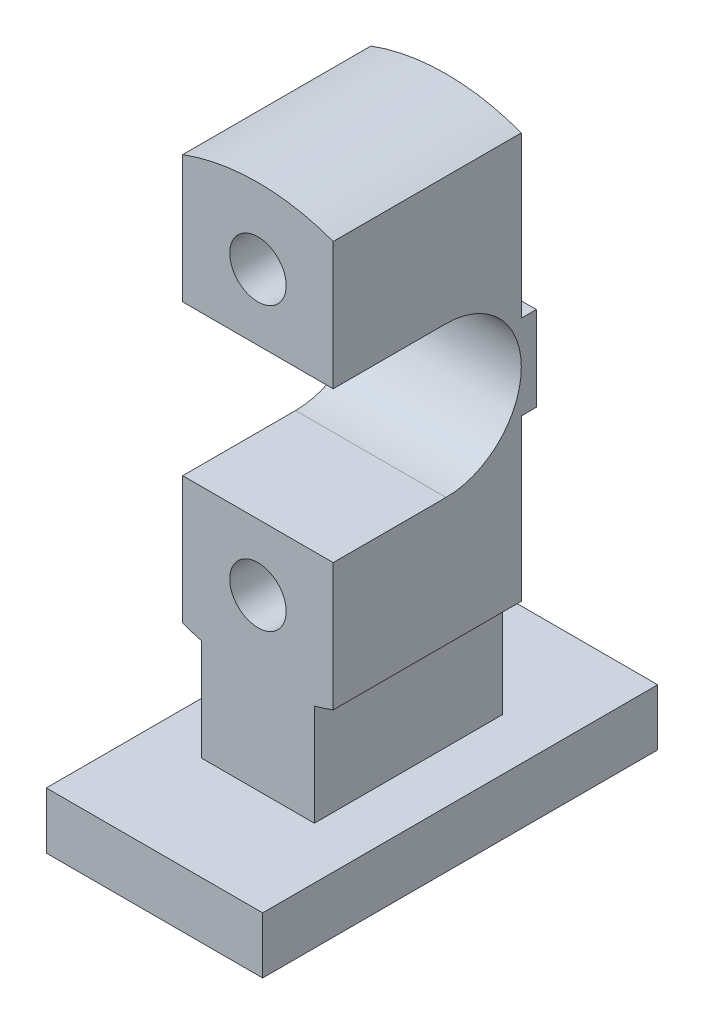
ISO-10303-21;
HEADER;
FILE_DESCRIPTION(('STEP AP214'),'2;1');
FILE_NAME('part.step','',(''),(''),'','','');
FILE_SCHEMA(('AUTOMOTIVE_DESIGN { 1 0 10303 214 1 1 1 1 }'));
ENDSEC;
DATA;
#1=APPLICATION_CONTEXT('core data for automotive mechanical design processes');
#2=APPLICATION_PROTOCOL_DEFINITION('international standard','automotive_design',2000,#1);
#3=PRODUCT_CONTEXT('',#1,'mechanical');
#4=PRODUCT('Part','Part','',(#3));
#5=PRODUCT_RELATED_PRODUCT_CATEGORY('part','',(#4));
#6=PRODUCT_DEFINITION_FORMATION('','',#4);
#7=PRODUCT_DEFINITION_CONTEXT('part definition',#1,'design');
#8=PRODUCT_DEFINITION('design','',#6,#7);
#9=PRODUCT_DEFINITION_SHAPE('','',#8);
#10=(LENGTH_UNIT() NAMED_UNIT(*) SI_UNIT(.MILLI.,.METRE.));
#11=(NAMED_UNIT(*) PLANE_ANGLE_UNIT() SI_UNIT($,.RADIAN.));
#12=(NAMED_UNIT(*) SI_UNIT($,.STERADIAN.) SOLID_ANGLE_UNIT());
#13=UNCERTAINTY_MEASURE_WITH_UNIT(LENGTH_MEASURE(1.E-05),#10,'distance_accuracy_value','');
#14=(GEOMETRIC_REPRESENTATION_CONTEXT(3) GLOBAL_UNCERTAINTY_ASSIGNED_CONTEXT((#13)) GLOBAL_UNIT_ASSIGNED_CONTEXT((#10,
#11,#12)) REPRESENTATION_CONTEXT('',''));
#15=CARTESIAN_POINT('',(0.,0.,0.));
#16=DIRECTION('',(0.,0.,1.));
#17=DIRECTION('',(1.,0.,0.));
#18=AXIS2_PLACEMENT_3D('',#15,#16,#17);
#19=CARTESIAN_POINT('',(0.,0.,50.));
#20=DIRECTION('',(0.,0.,1.));
#21=DIRECTION('',(1.,0.,0.));
#22=AXIS2_PLACEMENT_3D('',#19,#20,#21);
#23=PLANE('',#22);
#24=CARTESIAN_POINT('',(0.,270.,50.));
#25=DIRECTION('',(0.,0.,1.));
#26=DIRECTION('',(1.,0.,0.));
#27=AXIS2_PLACEMENT_3D('',#24,#25,#26);
#28=CIRCLE('',#27,15.);
#29=CARTESIAN_POINT('',(15.,270.,50.));
#30=VERTEX_POINT('',#29);
#31=EDGE_CURVE('E336',#30,#30,#28,.T.);
#32=ORIENTED_EDGE('',*,*,#31,.F.);
#33=EDGE_LOOP('',(#32));
#34=FACE_BOUND('',#33,.T.);
#35=DIRECTION('',(0.,-1.,0.));
#36=VECTOR('',#35,1.);
#37=CARTESIAN_POINT('',(-40.,87.1807067357609,50.));
#38=LINE('',#37,#36);
#39=CARTESIAN_POINT('',(-40.,302.819293264239,50.));
#40=VERTEX_POINT('',#39);
#41=CARTESIAN_POINT('',(-40.,235.,50.));
#42=VERTEX_POINT('',#41);
#43=EDGE_CURVE('E183',#40,#42,#38,.T.);
#44=ORIENTED_EDGE('',*,*,#43,.T.);
#45=DIRECTION('',(-1.,0.,0.));
#46=VECTOR('',#45,1.);
#47=CARTESIAN_POINT('',(140.,235.,50.));
#48=LINE('',#47,#46);
#49=CARTESIAN_POINT('',(40.,235.,50.));
#50=VERTEX_POINT('',#49);
#51=EDGE_CURVE('E169',#50,#42,#48,.T.);
#52=ORIENTED_EDGE('',*,*,#51,.F.);
#53=DIRECTION('',(0.,1.,0.));
#54=VECTOR('',#53,1.);
#55=CARTESIAN_POINT('',(40.,87.1807067357609,50.));
#56=LINE('',#55,#54);
#57=CARTESIAN_POINT('',(40.,302.819293264239,50.));
#58=VERTEX_POINT('',#57);
#59=EDGE_CURVE('E349',#50,#58,#56,.T.);
#60=ORIENTED_EDGE('',*,*,#59,.T.);
#61=CARTESIAN_POINT('',(0.,195.,50.));
#62=DIRECTION('',(0.,0.,1.));
#63=DIRECTION('',(1.,0.,0.));
#64=AXIS2_PLACEMENT_3D('',#61,#62,#63);
#65=CIRCLE('',#64,115.);
#66=EDGE_CURVE('E190',#58,#40,#65,.T.);
#67=ORIENTED_EDGE('',*,*,#66,.T.);
#68=EDGE_LOOP('',(#44,#52,#60,#67));
#69=FACE_BOUND('',#68,.T.);
#70=ADVANCED_FACE('F33',(#34,#69),#23,.T.);
#71=CARTESIAN_POINT('',(40.,87.1807067357609,50.));
#72=DIRECTION('',(-1.,0.,0.));
#73=DIRECTION('',(0.,0.,1.));
#74=AXIS2_PLACEMENT_3D('',#71,#72,#73);
#75=PLANE('',#74);
#76=DIRECTION('',(0.,0.,1.));
#77=VECTOR('',#76,1.);
#78=CARTESIAN_POINT('',(40.,235.,50.));
#79=LINE('',#78,#77);
#80=CARTESIAN_POINT('',(40.,235.,-9.99999999999999));
#81=VERTEX_POINT('',#80);
#82=EDGE_CURVE('E172',#81,#50,#79,.T.);
#83=ORIENTED_EDGE('',*,*,#82,.F.);
#84=CARTESIAN_POINT('',(40.,195.,-9.99999999999999));
#85=DIRECTION('',(-1.,0.,0.));
#86=DIRECTION('',(0.,0.,1.));
#87=AXIS2_PLACEMENT_3D('',#84,#85,#86);
#88=CIRCLE('',#87,40.);
#89=CARTESIAN_POINT('',(40.,155.,-9.99999999999999));
#90=VERTEX_POINT('',#89);
#91=EDGE_CURVE('E176',#81,#90,#88,.T.);
#92=ORIENTED_EDGE('',*,*,#91,.T.);
#93=DIRECTION('',(0.,0.,1.));
#94=VECTOR('',#93,1.);
#95=CARTESIAN_POINT('',(40.,155.,50.));
#96=LINE('',#95,#94);
#97=CARTESIAN_POINT('',(40.,155.,50.));
#98=VERTEX_POINT('',#97);
#99=EDGE_CURVE('E383',#90,#98,#96,.T.);
#100=ORIENTED_EDGE('',*,*,#99,.T.);
#101=CARTESIAN_POINT('',(40.,87.1807067357609,50.));
#102=VERTEX_POINT('',#101);
#103=EDGE_CURVE('E350',#102,#98,#56,.T.);
#104=ORIENTED_EDGE('',*,*,#103,.F.);
#105=DIRECTION('',(0.,0.,-1.));
#106=VECTOR('',#105,1.);
#107=CARTESIAN_POINT('',(40.,87.1807067357609,50.));
#108=LINE('',#107,#106);
#109=CARTESIAN_POINT('',(40.,87.1807067357609,-50.));
#110=VERTEX_POINT('',#109);
#111=EDGE_CURVE('E220',#102,#110,#108,.T.);
#112=ORIENTED_EDGE('',*,*,#111,.T.);
#113=DIRECTION('',(0.,1.,0.));
#114=VECTOR('',#113,1.);
#115=CARTESIAN_POINT('',(40.,87.1807067357609,-50.));
#116=LINE('',#115,#114);
#117=CARTESIAN_POINT('',(40.,172.5,-50.));
#118=VERTEX_POINT('',#117);
#119=EDGE_CURVE('E206',#110,#118,#116,.T.);
#120=ORIENTED_EDGE('',*,*,#119,.T.);
#121=DIRECTION('',(0.,0.,-1.));
#122=VECTOR('',#121,1.);
#123=CARTESIAN_POINT('',(40.,172.5,-50.));
#124=LINE('',#123,#122);
#125=CARTESIAN_POINT('',(40.,172.5,-58.));
#126=VERTEX_POINT('',#125);
#127=EDGE_CURVE('E374',#118,#126,#124,.T.);
#128=ORIENTED_EDGE('',*,*,#127,.T.);
#129=DIRECTION('',(0.,-1.,0.));
#130=VECTOR('',#129,1.);
#131=CARTESIAN_POINT('',(40.,217.5,-58.));
#132=LINE('',#131,#130);
#133=CARTESIAN_POINT('',(40.,217.5,-58.));
#134=VERTEX_POINT('',#133);
#135=EDGE_CURVE('E371',#134,#126,#132,.T.);
#136=ORIENTED_EDGE('',*,*,#135,.F.);
#137=DIRECTION('',(0.,0.,-1.));
#138=VECTOR('',#137,1.);
#139=CARTESIAN_POINT('',(40.,217.5,-50.));
#140=LINE('',#139,#138);
#141=CARTESIAN_POINT('',(40.,217.5,-50.));
#142=VERTEX_POINT('',#141);
#143=EDGE_CURVE('E369',#142,#134,#140,.T.);
#144=ORIENTED_EDGE('',*,*,#143,.F.);
#145=CARTESIAN_POINT('',(40.,302.819293264239,-50.));
#146=VERTEX_POINT('',#145);
#147=EDGE_CURVE('E204',#142,#146,#116,.T.);
#148=ORIENTED_EDGE('',*,*,#147,.T.);
#149=DIRECTION('',(0.,0.,-1.));
#150=VECTOR('',#149,1.);
#151=CARTESIAN_POINT('',(40.,302.819293264239,50.));
#152=LINE('',#151,#150);
#153=EDGE_CURVE('E217',#58,#146,#152,.T.);
#154=ORIENTED_EDGE('',*,*,#153,.F.);
#155=ORIENTED_EDGE('',*,*,#59,.F.);
#156=EDGE_LOOP('',(#83,#92,#100,#104,#112,#120,#128,#136,#144,#148,#154,#155));
#157=FACE_BOUND('',#156,.T.);
#158=ADVANCED_FACE('F301',(#157),#75,.F.);
#159=CARTESIAN_POINT('',(-40.,87.1807067357609,50.));
#160=DIRECTION('',(1.,0.,0.));
#161=DIRECTION('',(0.,1.,0.));
#162=AXIS2_PLACEMENT_3D('',#159,#160,#161);
#163=PLANE('',#162);
#164=DIRECTION('',(0.,0.,1.));
#165=VECTOR('',#164,1.);
#166=CARTESIAN_POINT('',(-40.,235.,-9.99999999999999));
#167=LINE('',#166,#165);
#168=CARTESIAN_POINT('',(-40.,235.,-9.99999999999999));
#169=VERTEX_POINT('',#168);
#170=EDGE_CURVE('E48',#169,#42,#167,.T.);
#171=ORIENTED_EDGE('',*,*,#170,.T.);
#172=ORIENTED_EDGE('',*,*,#43,.F.);
#173=DIRECTION('',(0.,0.,-1.));
#174=VECTOR('',#173,1.);
#175=CARTESIAN_POINT('',(-40.,302.819293264239,50.));
#176=LINE('',#175,#174);
#177=CARTESIAN_POINT('',(-40.,302.819293264239,-50.));
#178=VERTEX_POINT('',#177);
#179=EDGE_CURVE('E196',#40,#178,#176,.T.);
#180=ORIENTED_EDGE('',*,*,#179,.T.);
#181=DIRECTION('',(0.,-1.,0.));
#182=VECTOR('',#181,1.);
#183=CARTESIAN_POINT('',(-40.,87.1807067357609,-50.));
#184=LINE('',#183,#182);
#185=CARTESIAN_POINT('',(-40.,217.5,-50.));
#186=VERTEX_POINT('',#185);
#187=EDGE_CURVE('E212',#178,#186,#184,.T.);
#188=ORIENTED_EDGE('',*,*,#187,.T.);
#189=DIRECTION('',(0.,0.,-1.));
#190=VECTOR('',#189,1.);
#191=CARTESIAN_POINT('',(-40.,217.5,-50.));
#192=LINE('',#191,#190);
#193=CARTESIAN_POINT('',(-40.,217.5,-58.));
#194=VERTEX_POINT('',#193);
#195=EDGE_CURVE('E377',#186,#194,#192,.T.);
#196=ORIENTED_EDGE('',*,*,#195,.T.);
#197=DIRECTION('',(0.,-1.,0.));
#198=VECTOR('',#197,1.);
#199=CARTESIAN_POINT('',(-40.,217.5,-58.));
#200=LINE('',#199,#198);
#201=CARTESIAN_POINT('',(-40.,172.5,-58.));
#202=VERTEX_POINT('',#201);
#203=EDGE_CURVE('E379',#194,#202,#200,.T.);
#204=ORIENTED_EDGE('',*,*,#203,.T.);
#205=DIRECTION('',(0.,0.,-1.));
#206=VECTOR('',#205,1.);
#207=CARTESIAN_POINT('',(-40.,172.5,-50.));
#208=LINE('',#207,#206);
#209=CARTESIAN_POINT('',(-40.,172.5,-50.));
#210=VERTEX_POINT('',#209);
#211=EDGE_CURVE('E56',#210,#202,#208,.T.);
#212=ORIENTED_EDGE('',*,*,#211,.F.);
#213=CARTESIAN_POINT('',(-40.,87.1807067357609,-50.));
#214=VERTEX_POINT('',#213);
#215=EDGE_CURVE('E211',#210,#214,#184,.T.);
#216=ORIENTED_EDGE('',*,*,#215,.T.);
#217=DIRECTION('',(0.,0.,-1.));
#218=VECTOR('',#217,1.);
#219=CARTESIAN_POINT('',(-40.,87.1807067357609,50.));
#220=LINE('',#219,#218);
#221=CARTESIAN_POINT('',(-40.,87.1807067357609,50.));
#222=VERTEX_POINT('',#221);
#223=EDGE_CURVE('E192',#222,#214,#220,.T.);
#224=ORIENTED_EDGE('',*,*,#223,.F.);
#225=CARTESIAN_POINT('',(-40.,155.,50.));
#226=VERTEX_POINT('',#225);
#227=EDGE_CURVE('E193',#226,#222,#38,.T.);
#228=ORIENTED_EDGE('',*,*,#227,.F.);
#229=DIRECTION('',(0.,0.,1.));
#230=VECTOR('',#229,1.);
#231=CARTESIAN_POINT('',(-40.,155.,-9.99999999999998));
#232=LINE('',#231,#230);
#233=CARTESIAN_POINT('',(-40.,155.,-9.99999999999999));
#234=VERTEX_POINT('',#233);
#235=EDGE_CURVE('E187',#234,#226,#232,.T.);
#236=ORIENTED_EDGE('',*,*,#235,.F.);
#237=CARTESIAN_POINT('',(-40.,195.,-9.99999999999999));
#238=DIRECTION('',(-1.,0.,0.));
#239=DIRECTION('',(0.,-1.,0.));
#240=AXIS2_PLACEMENT_3D('',#237,#238,#239);
#241=CIRCLE('',#240,40.);
#242=EDGE_CURVE('E186',#169,#234,#241,.T.);
#243=ORIENTED_EDGE('',*,*,#242,.F.);
#244=EDGE_LOOP('',(#171,#172,#180,#188,#196,#204,#212,#216,#224,#228,#236,#243));
#245=FACE_BOUND('',#244,.T.);
#246=ADVANCED_FACE('F181',(#245),#163,.F.);
#247=CARTESIAN_POINT('',(0.,0.,-50.));
#248=DIRECTION('',(0.,0.,1.));
#249=DIRECTION('',(1.,0.,0.));
#250=AXIS2_PLACEMENT_3D('',#247,#248,#249);
#251=PLANE('',#250);
#252=CARTESIAN_POINT('',(0.,270.,-50.));
#253=DIRECTION('',(0.,0.,1.));
#254=DIRECTION('',(1.,0.,0.));
#255=AXIS2_PLACEMENT_3D('',#252,#253,#254);
#256=CIRCLE('',#255,15.);
#257=CARTESIAN_POINT('',(15.,270.,-50.));
#258=VERTEX_POINT('',#257);
#259=EDGE_CURVE('E332',#258,#258,#256,.T.);
#260=ORIENTED_EDGE('',*,*,#259,.T.);
#261=EDGE_LOOP('',(#260));
#262=FACE_BOUND('',#261,.T.);
#263=DIRECTION('',(1.,0.,0.));
#264=VECTOR('',#263,1.);
#265=CARTESIAN_POINT('',(-40.,217.5,-50.));
#266=LINE('',#265,#264);
#267=EDGE_CURVE('E361',#186,#142,#266,.T.);
#268=ORIENTED_EDGE('',*,*,#267,.F.);
#269=ORIENTED_EDGE('',*,*,#187,.F.);
#270=CARTESIAN_POINT('',(0.,195.,-50.));
#271=DIRECTION('',(0.,0.,1.));
#272=DIRECTION('',(1.,0.,0.));
#273=AXIS2_PLACEMENT_3D('',#270,#271,#272);
#274=CIRCLE('',#273,115.);
#275=EDGE_CURVE('E209',#146,#178,#274,.T.);
#276=ORIENTED_EDGE('',*,*,#275,.F.);
#277=ORIENTED_EDGE('',*,*,#147,.F.);
#278=EDGE_LOOP('',(#268,#269,#276,#277));
#279=FACE_BOUND('',#278,.T.);
#280=ADVANCED_FACE('F322',(#262,#279),#251,.F.);
#281=CARTESIAN_POINT('',(-30.,30.,50.));
#282=DIRECTION('',(-1.,0.,0.));
#283=DIRECTION('',(0.,0.,1.));
#284=AXIS2_PLACEMENT_3D('',#281,#282,#283);
#285=PLANE('',#284);
#286=DIRECTION('',(0.,1.,0.));
#287=VECTOR('',#286,1.);
#288=CARTESIAN_POINT('',(-30.,30.,50.));
#289=LINE('',#288,#287);
#290=CARTESIAN_POINT('',(-30.,30.,50.));
#291=VERTEX_POINT('',#290);
#292=CARTESIAN_POINT('',(-30.,83.9819834441274,50.));
#293=VERTEX_POINT('',#292);
#294=EDGE_CURVE('E235',#291,#293,#289,.T.);
#295=ORIENTED_EDGE('',*,*,#294,.T.);
#296=DIRECTION('',(0.,0.,-1.));
#297=VECTOR('',#296,1.);
#298=CARTESIAN_POINT('',(-30.,83.9819834441274,50.));
#299=LINE('',#298,#297);
#300=CARTESIAN_POINT('',(-30.,83.9819834441274,-50.));
#301=VERTEX_POINT('',#300);
#302=EDGE_CURVE('E226',#293,#301,#299,.T.);
#303=ORIENTED_EDGE('',*,*,#302,.T.);
#304=DIRECTION('',(0.,1.,0.));
#305=VECTOR('',#304,1.);
#306=CARTESIAN_POINT('',(-30.,30.,-50.));
#307=LINE('',#306,#305);
#308=CARTESIAN_POINT('',(-30.,30.,-50.));
#309=VERTEX_POINT('',#308);
#310=EDGE_CURVE('E233',#309,#301,#307,.T.);
#311=ORIENTED_EDGE('',*,*,#310,.F.);
#312=DIRECTION('',(0.,0.,-1.));
#313=VECTOR('',#312,1.);
#314=CARTESIAN_POINT('',(-30.,30.,50.));
#315=LINE('',#314,#313);
#316=EDGE_CURVE('E244',#291,#309,#315,.T.);
#317=ORIENTED_EDGE('',*,*,#316,.F.);
#318=EDGE_LOOP('',(#295,#303,#311,#317));
#319=FACE_BOUND('',#318,.T.);
#320=ADVANCED_FACE('F406',(#319),#285,.T.);
#321=CARTESIAN_POINT('',(30.,30.,50.));
#322=DIRECTION('',(-1.,0.,0.));
#323=DIRECTION('',(0.,0.,1.));
#324=AXIS2_PLACEMENT_3D('',#321,#322,#323);
#325=PLANE('',#324);
#326=DIRECTION('',(0.,0.,-1.));
#327=VECTOR('',#326,1.);
#328=CARTESIAN_POINT('',(30.,83.9819834441274,50.));
#329=LINE('',#328,#327);
#330=CARTESIAN_POINT('',(30.,83.9819834441274,50.));
#331=VERTEX_POINT('',#330);
#332=CARTESIAN_POINT('',(30.,83.9819834441274,-50.));
#333=VERTEX_POINT('',#332);
#334=EDGE_CURVE('E223',#331,#333,#329,.T.);
#335=ORIENTED_EDGE('',*,*,#334,.F.);
#336=DIRECTION('',(0.,1.,0.));
#337=VECTOR('',#336,1.);
#338=CARTESIAN_POINT('',(30.,30.,50.));
#339=LINE('',#338,#337);
#340=CARTESIAN_POINT('',(30.,30.,50.));
#341=VERTEX_POINT('',#340);
#342=EDGE_CURVE('E229',#341,#331,#339,.T.);
#343=ORIENTED_EDGE('',*,*,#342,.F.);
#344=DIRECTION('',(0.,0.,-1.));
#345=VECTOR('',#344,1.);
#346=CARTESIAN_POINT('',(30.,30.,50.));
#347=LINE('',#346,#345);
#348=CARTESIAN_POINT('',(30.,30.,-50.));
#349=VERTEX_POINT('',#348);
#350=EDGE_CURVE('E237',#341,#349,#347,.T.);
#351=ORIENTED_EDGE('',*,*,#350,.T.);
#352=DIRECTION('',(0.,1.,0.));
#353=VECTOR('',#352,1.);
#354=CARTESIAN_POINT('',(30.,30.,-50.));
#355=LINE('',#354,#353);
#356=EDGE_CURVE('E228',#349,#333,#355,.T.);
#357=ORIENTED_EDGE('',*,*,#356,.T.);
#358=EDGE_LOOP('',(#335,#343,#351,#357));
#359=FACE_BOUND('',#358,.T.);
#360=ADVANCED_FACE('F299',(#359),#325,.F.);
#361=CARTESIAN_POINT('',(57.5,30.,105.));
#362=DIRECTION('',(-1.,0.,0.));
#363=DIRECTION('',(0.,0.,1.));
#364=AXIS2_PLACEMENT_3D('',#361,#362,#363);
#365=PLANE('',#364);
#366=DIRECTION('',(0.,0.,-1.));
#367=VECTOR('',#366,1.);
#368=CARTESIAN_POINT('',(57.5,0.,105.));
#369=LINE('',#368,#367);
#370=CARTESIAN_POINT('',(57.5,0.,105.));
#371=VERTEX_POINT('',#370);
#372=CARTESIAN_POINT('',(57.5,0.,-105.));
#373=VERTEX_POINT('',#372);
#374=EDGE_CURVE('E247',#371,#373,#369,.T.);
#375=ORIENTED_EDGE('',*,*,#374,.T.);
#376=DIRECTION('',(0.,-1.,0.));
#377=VECTOR('',#376,1.);
#378=CARTESIAN_POINT('',(57.5,30.,-105.));
#379=LINE('',#378,#377);
#380=CARTESIAN_POINT('',(57.5,30.,-105.));
#381=VERTEX_POINT('',#380);
#382=EDGE_CURVE('E11',#381,#373,#379,.T.);
#383=ORIENTED_EDGE('',*,*,#382,.F.);
#384=DIRECTION('',(0.,0.,-1.));
#385=VECTOR('',#384,1.);
#386=CARTESIAN_POINT('',(57.5,30.,105.));
#387=LINE('',#386,#385);
#388=CARTESIAN_POINT('',(57.5,30.,105.));
#389=VERTEX_POINT('',#388);
#390=EDGE_CURVE('E249',#389,#381,#387,.T.);
#391=ORIENTED_EDGE('',*,*,#390,.F.);
#392=DIRECTION('',(0.,-1.,0.));
#393=VECTOR('',#392,1.);
#394=CARTESIAN_POINT('',(57.5,30.,105.));
#395=LINE('',#394,#393);
#396=EDGE_CURVE('E259',#389,#371,#395,.T.);
#397=ORIENTED_EDGE('',*,*,#396,.T.);
#398=EDGE_LOOP('',(#375,#383,#391,#397));
#399=FACE_BOUND('',#398,.T.);
#400=ADVANCED_FACE('F35',(#399),#365,.F.);
#401=CARTESIAN_POINT('',(-57.5,30.,-105.));
#402=DIRECTION('',(0.,0.,1.));
#403=DIRECTION('',(1.,0.,0.));
#404=AXIS2_PLACEMENT_3D('',#401,#402,#403);
#405=PLANE('',#404);
#406=DIRECTION('',(-1.,0.,0.));
#407=VECTOR('',#406,1.);
#408=CARTESIAN_POINT('',(-57.5,0.,-105.));
#409=LINE('',#408,#407);
#410=CARTESIAN_POINT('',(-57.5,0.,-105.));
#411=VERTEX_POINT('',#410);
#412=EDGE_CURVE('E262',#373,#411,#409,.T.);
#413=ORIENTED_EDGE('',*,*,#412,.T.);
#414=DIRECTION('',(0.,-1.,0.));
#415=VECTOR('',#414,1.);
#416=CARTESIAN_POINT('',(-57.5,30.,-105.));
#417=LINE('',#416,#415);
#418=CARTESIAN_POINT('',(-57.5,30.,-105.));
#419=VERTEX_POINT('',#418);
#420=EDGE_CURVE('E41',#419,#411,#417,.T.);
#421=ORIENTED_EDGE('',*,*,#420,.F.);
#422=DIRECTION('',(-1.,0.,0.));
#423=VECTOR('',#422,1.);
#424=CARTESIAN_POINT('',(-57.5,30.,-105.));
#425=LINE('',#424,#423);
#426=EDGE_CURVE('E252',#381,#419,#425,.T.);
#427=ORIENTED_EDGE('',*,*,#426,.F.);
#428=ORIENTED_EDGE('',*,*,#382,.T.);
#429=EDGE_LOOP('',(#413,#421,#427,#428));
#430=FACE_BOUND('',#429,.T.);
#431=ADVANCED_FACE('F292',(#430),#405,.F.);
#432=CARTESIAN_POINT('',(-57.5,30.,105.));
#433=DIRECTION('',(1.,0.,0.));
#434=DIRECTION('',(0.,0.,-1.));
#435=AXIS2_PLACEMENT_3D('',#432,#433,#434);
#436=PLANE('',#435);
#437=DIRECTION('',(0.,0.,1.));
#438=VECTOR('',#437,1.);
#439=CARTESIAN_POINT('',(-57.5,0.,105.));
#440=LINE('',#439,#438);
#441=CARTESIAN_POINT('',(-57.5,0.,105.));
#442=VERTEX_POINT('',#441);
#443=EDGE_CURVE('E264',#411,#442,#440,.T.);
#444=ORIENTED_EDGE('',*,*,#443,.T.);
#445=DIRECTION('',(0.,-1.,0.));
#446=VECTOR('',#445,1.);
#447=CARTESIAN_POINT('',(-57.5,30.,105.));
#448=LINE('',#447,#446);
#449=CARTESIAN_POINT('',(-57.5,30.,105.));
#450=VERTEX_POINT('',#449);
#451=EDGE_CURVE('E269',#450,#442,#448,.T.);
#452=ORIENTED_EDGE('',*,*,#451,.F.);
#453=DIRECTION('',(0.,0.,1.));
#454=VECTOR('',#453,1.);
#455=CARTESIAN_POINT('',(-57.5,30.,105.));
#456=LINE('',#455,#454);
#457=EDGE_CURVE('E255',#419,#450,#456,.T.);
#458=ORIENTED_EDGE('',*,*,#457,.F.);
#459=ORIENTED_EDGE('',*,*,#420,.T.);
#460=EDGE_LOOP('',(#444,#452,#458,#459));
#461=FACE_BOUND('',#460,.T.);
#462=ADVANCED_FACE('F276',(#461),#436,.F.);
#463=CARTESIAN_POINT('',(-57.5,30.,105.));
#464=DIRECTION('',(0.,0.,-1.));
#465=DIRECTION('',(-1.,0.,0.));
#466=AXIS2_PLACEMENT_3D('',#463,#464,#465);
#467=PLANE('',#466);
#468=DIRECTION('',(1.,0.,0.));
#469=VECTOR('',#468,1.);
#470=CARTESIAN_POINT('',(-57.5,0.,105.));
#471=LINE('',#470,#469);
#472=EDGE_CURVE('E253',#442,#371,#471,.T.);
#473=ORIENTED_EDGE('',*,*,#472,.T.);
#474=ORIENTED_EDGE('',*,*,#396,.F.);
#475=DIRECTION('',(1.,0.,0.));
#476=VECTOR('',#475,1.);
#477=CARTESIAN_POINT('',(-57.5,30.,105.));
#478=LINE('',#477,#476);
#479=EDGE_CURVE('E257',#450,#389,#478,.T.);
#480=ORIENTED_EDGE('',*,*,#479,.F.);
#481=ORIENTED_EDGE('',*,*,#451,.T.);
#482=EDGE_LOOP('',(#473,#474,#480,#481));
#483=FACE_BOUND('',#482,.T.);
#484=ADVANCED_FACE('F285',(#483),#467,.F.);
#485=CARTESIAN_POINT('',(0.,30.,0.));
#486=DIRECTION('',(0.,-1.,0.));
#487=DIRECTION('',(0.,0.,-1.));
#488=AXIS2_PLACEMENT_3D('',#485,#486,#487);
#489=PLANE('',#488);
#490=ORIENTED_EDGE('',*,*,#316,.T.);
#491=DIRECTION('',(1.,0.,0.));
#492=VECTOR('',#491,1.);
#493=CARTESIAN_POINT('',(-30.,30.,-50.));
#494=LINE('',#493,#492);
#495=EDGE_CURVE('E239',#309,#349,#494,.T.);
#496=ORIENTED_EDGE('',*,*,#495,.T.);
#497=ORIENTED_EDGE('',*,*,#350,.F.);
#498=DIRECTION('',(1.,0.,0.));
#499=VECTOR('',#498,1.);
#500=CARTESIAN_POINT('',(-30.,30.,50.));
#501=LINE('',#500,#499);
#502=EDGE_CURVE('E232',#291,#341,#501,.T.);
#503=ORIENTED_EDGE('',*,*,#502,.F.);
#504=EDGE_LOOP('',(#490,#496,#497,#503));
#505=FACE_BOUND('',#504,.T.);
#506=ORIENTED_EDGE('',*,*,#390,.T.);
#507=ORIENTED_EDGE('',*,*,#426,.T.);
#508=ORIENTED_EDGE('',*,*,#457,.T.);
#509=ORIENTED_EDGE('',*,*,#479,.T.);
#510=EDGE_LOOP('',(#506,#507,#508,#509));
#511=FACE_BOUND('',#510,.T.);
#512=ADVANCED_FACE('F291',(#505,#511),#489,.F.);
#513=CARTESIAN_POINT('',(0.,0.,0.));
#514=DIRECTION('',(0.,-1.,0.));
#515=DIRECTION('',(0.,0.,-1.));
#516=AXIS2_PLACEMENT_3D('',#513,#514,#515);
#517=PLANE('',#516);
#518=ORIENTED_EDGE('',*,*,#374,.F.);
#519=ORIENTED_EDGE('',*,*,#472,.F.);
#520=ORIENTED_EDGE('',*,*,#443,.F.);
#521=ORIENTED_EDGE('',*,*,#412,.F.);
#522=EDGE_LOOP('',(#518,#519,#520,#521));
#523=FACE_BOUND('',#522,.T.);
#524=ADVANCED_FACE('F282',(#523),#517,.T.);
#525=DIRECTION('',(-1.,0.,0.));
#526=VECTOR('',#525,1.);
#527=CARTESIAN_POINT('',(140.,155.,50.));
#528=LINE('',#527,#526);
#529=EDGE_CURVE('E177',#98,#226,#528,.T.);
#530=ORIENTED_EDGE('',*,*,#529,.T.);
#531=ORIENTED_EDGE('',*,*,#227,.T.);
#532=CARTESIAN_POINT('',(0.,195.,50.));
#533=DIRECTION('',(0.,0.,1.));
#534=DIRECTION('',(1.,0.,0.));
#535=AXIS2_PLACEMENT_3D('',#532,#533,#534);
#536=CIRCLE('',#535,115.);
#537=EDGE_CURVE('E347',#222,#293,#536,.T.);
#538=ORIENTED_EDGE('',*,*,#537,.T.);
#539=ORIENTED_EDGE('',*,*,#294,.F.);
#540=ORIENTED_EDGE('',*,*,#502,.T.);
#541=ORIENTED_EDGE('',*,*,#342,.T.);
#542=EDGE_CURVE('E214',#331,#102,#536,.T.);
#543=ORIENTED_EDGE('',*,*,#542,.T.);
#544=ORIENTED_EDGE('',*,*,#103,.T.);
#545=EDGE_LOOP('',(#530,#531,#538,#539,#540,#541,#543,#544));
#546=FACE_BOUND('',#545,.T.);
#547=CARTESIAN_POINT('',(0.,120.,50.));
#548=DIRECTION('',(0.,0.,1.));
#549=DIRECTION('',(1.,0.,0.));
#550=AXIS2_PLACEMENT_3D('',#547,#548,#549);
#551=CIRCLE('',#550,15.);
#552=CARTESIAN_POINT('',(15.,120.,50.));
#553=VERTEX_POINT('',#552);
#554=EDGE_CURVE('E330',#553,#553,#551,.T.);
#555=ORIENTED_EDGE('',*,*,#554,.F.);
#556=EDGE_LOOP('',(#555));
#557=FACE_BOUND('',#556,.T.);
#558=ADVANCED_FACE('F304',(#546,#557),#23,.T.);
#559=ORIENTED_EDGE('',*,*,#215,.F.);
#560=DIRECTION('',(1.,0.,0.));
#561=VECTOR('',#560,1.);
#562=CARTESIAN_POINT('',(-40.,172.5,-50.));
#563=LINE('',#562,#561);
#564=EDGE_CURVE('E339',#210,#118,#563,.T.);
#565=ORIENTED_EDGE('',*,*,#564,.T.);
#566=ORIENTED_EDGE('',*,*,#119,.F.);
#567=CARTESIAN_POINT('',(0.,195.,-50.));
#568=DIRECTION('',(0.,0.,1.));
#569=DIRECTION('',(1.,0.,0.));
#570=AXIS2_PLACEMENT_3D('',#567,#568,#569);
#571=CIRCLE('',#570,115.);
#572=EDGE_CURVE('E205',#333,#110,#571,.T.);
#573=ORIENTED_EDGE('',*,*,#572,.F.);
#574=ORIENTED_EDGE('',*,*,#356,.F.);
#575=ORIENTED_EDGE('',*,*,#495,.F.);
#576=ORIENTED_EDGE('',*,*,#310,.T.);
#577=EDGE_CURVE('E201',#214,#301,#571,.T.);
#578=ORIENTED_EDGE('',*,*,#577,.F.);
#579=EDGE_LOOP('',(#559,#565,#566,#573,#574,#575,#576,#578));
#580=FACE_BOUND('',#579,.T.);
#581=CARTESIAN_POINT('',(0.,120.,-50.));
#582=DIRECTION('',(0.,0.,1.));
#583=DIRECTION('',(1.,0.,0.));
#584=AXIS2_PLACEMENT_3D('',#581,#582,#583);
#585=CIRCLE('',#584,15.);
#586=CARTESIAN_POINT('',(15.,120.,-50.));
#587=VERTEX_POINT('',#586);
#588=EDGE_CURVE('E333',#587,#587,#585,.T.);
#589=ORIENTED_EDGE('',*,*,#588,.T.);
#590=EDGE_LOOP('',(#589));
#591=FACE_BOUND('',#590,.T.);
#592=ADVANCED_FACE('F314',(#580,#591),#251,.F.);
#593=CARTESIAN_POINT('',(0.,195.,50.));
#594=DIRECTION('',(0.,0.,-1.));
#595=DIRECTION('',(-1.,0.,0.));
#596=AXIS2_PLACEMENT_3D('',#593,#594,#595);
#597=CYLINDRICAL_SURFACE('',#596,115.);
#598=ORIENTED_EDGE('',*,*,#542,.F.);
#599=ORIENTED_EDGE('',*,*,#334,.T.);
#600=ORIENTED_EDGE('',*,*,#572,.T.);
#601=ORIENTED_EDGE('',*,*,#111,.F.);
#602=EDGE_LOOP('',(#598,#599,#600,#601));
#603=FACE_BOUND('',#602,.T.);
#604=ADVANCED_FACE('F320',(#603),#597,.T.);
#605=ORIENTED_EDGE('',*,*,#302,.F.);
#606=ORIENTED_EDGE('',*,*,#537,.F.);
#607=ORIENTED_EDGE('',*,*,#223,.T.);
#608=ORIENTED_EDGE('',*,*,#577,.T.);
#609=EDGE_LOOP('',(#605,#606,#607,#608));
#610=FACE_BOUND('',#609,.T.);
#611=ADVANCED_FACE('F403',(#610),#597,.T.);
#612=CARTESIAN_POINT('',(0.,195.,50.));
#613=DIRECTION('',(0.,0.,-1.));
#614=DIRECTION('',(-1.,0.,0.));
#615=AXIS2_PLACEMENT_3D('',#612,#613,#614);
#616=CYLINDRICAL_SURFACE('',#615,115.);
#617=ORIENTED_EDGE('',*,*,#275,.T.);
#618=ORIENTED_EDGE('',*,*,#179,.F.);
#619=ORIENTED_EDGE('',*,*,#66,.F.);
#620=ORIENTED_EDGE('',*,*,#153,.T.);
#621=EDGE_LOOP('',(#617,#618,#619,#620));
#622=FACE_BOUND('',#621,.T.);
#623=ADVANCED_FACE('F357',(#622),#616,.T.);
#624=CARTESIAN_POINT('',(0.,270.,50.));
#625=DIRECTION('',(0.,0.,-1.));
#626=DIRECTION('',(-1.,0.,0.));
#627=AXIS2_PLACEMENT_3D('',#624,#625,#626);
#628=CYLINDRICAL_SURFACE('',#627,15.);
#629=ORIENTED_EDGE('',*,*,#31,.T.);
#630=EDGE_LOOP('',(#629));
#631=FACE_BOUND('',#630,.T.);
#632=ORIENTED_EDGE('',*,*,#259,.F.);
#633=EDGE_LOOP('',(#632));
#634=FACE_BOUND('',#633,.T.);
#635=ADVANCED_FACE('F445',(#631,#634),#628,.F.);
#636=CARTESIAN_POINT('',(0.,120.,50.));
#637=DIRECTION('',(0.,0.,-1.));
#638=DIRECTION('',(-1.,0.,0.));
#639=AXIS2_PLACEMENT_3D('',#636,#637,#638);
#640=CYLINDRICAL_SURFACE('',#639,15.);
#641=ORIENTED_EDGE('',*,*,#554,.T.);
#642=EDGE_LOOP('',(#641));
#643=FACE_BOUND('',#642,.T.);
#644=ORIENTED_EDGE('',*,*,#588,.F.);
#645=EDGE_LOOP('',(#644));
#646=FACE_BOUND('',#645,.T.);
#647=ADVANCED_FACE('F441',(#643,#646),#640,.F.);
#648=CARTESIAN_POINT('',(-40.,172.5,-50.));
#649=DIRECTION('',(0.,-1.,0.));
#650=DIRECTION('',(0.,0.,-1.));
#651=AXIS2_PLACEMENT_3D('',#648,#649,#650);
#652=PLANE('',#651);
#653=ORIENTED_EDGE('',*,*,#127,.F.);
#654=ORIENTED_EDGE('',*,*,#564,.F.);
#655=ORIENTED_EDGE('',*,*,#211,.T.);
#656=DIRECTION('',(1.,0.,0.));
#657=VECTOR('',#656,1.);
#658=CARTESIAN_POINT('',(-40.,172.5,-58.));
#659=LINE('',#658,#657);
#660=EDGE_CURVE('E342',#202,#126,#659,.T.);
#661=ORIENTED_EDGE('',*,*,#660,.T.);
#662=EDGE_LOOP('',(#653,#654,#655,#661));
#663=FACE_BOUND('',#662,.T.);
#664=ADVANCED_FACE('F435',(#663),#652,.T.);
#665=CARTESIAN_POINT('',(-40.,217.5,-50.));
#666=DIRECTION('',(0.,-1.,0.));
#667=DIRECTION('',(0.,0.,-1.));
#668=AXIS2_PLACEMENT_3D('',#665,#666,#667);
#669=PLANE('',#668);
#670=ORIENTED_EDGE('',*,*,#143,.T.);
#671=DIRECTION('',(1.,0.,0.));
#672=VECTOR('',#671,1.);
#673=CARTESIAN_POINT('',(-40.,217.5,-58.));
#674=LINE('',#673,#672);
#675=EDGE_CURVE('E363',#194,#134,#674,.T.);
#676=ORIENTED_EDGE('',*,*,#675,.F.);
#677=ORIENTED_EDGE('',*,*,#195,.F.);
#678=ORIENTED_EDGE('',*,*,#267,.T.);
#679=EDGE_LOOP('',(#670,#676,#677,#678));
#680=FACE_BOUND('',#679,.T.);
#681=ADVANCED_FACE('F432',(#680),#669,.F.);
#682=CARTESIAN_POINT('',(-40.,217.5,-58.));
#683=DIRECTION('',(0.,0.,1.));
#684=DIRECTION('',(0.,-1.,0.));
#685=AXIS2_PLACEMENT_3D('',#682,#683,#684);
#686=PLANE('',#685);
#687=ORIENTED_EDGE('',*,*,#135,.T.);
#688=ORIENTED_EDGE('',*,*,#660,.F.);
#689=ORIENTED_EDGE('',*,*,#203,.F.);
#690=ORIENTED_EDGE('',*,*,#675,.T.);
#691=EDGE_LOOP('',(#687,#688,#689,#690));
#692=FACE_BOUND('',#691,.T.);
#693=ADVANCED_FACE('F431',(#692),#686,.F.);
#694=CARTESIAN_POINT('',(140.,235.,-9.99999999999999));
#695=DIRECTION('',(0.,-1.,0.));
#696=DIRECTION('',(1.,0.,0.));
#697=AXIS2_PLACEMENT_3D('',#694,#695,#696);
#698=PLANE('',#697);
#699=ORIENTED_EDGE('',*,*,#82,.T.);
#700=ORIENTED_EDGE('',*,*,#51,.T.);
#701=ORIENTED_EDGE('',*,*,#170,.F.);
#702=DIRECTION('',(-1.,0.,0.));
#703=VECTOR('',#702,1.);
#704=CARTESIAN_POINT('',(140.,235.,-9.99999999999999));
#705=LINE('',#704,#703);
#706=EDGE_CURVE('E391',#81,#169,#705,.T.);
#707=ORIENTED_EDGE('',*,*,#706,.F.);
#708=EDGE_LOOP('',(#699,#700,#701,#707));
#709=FACE_BOUND('',#708,.T.);
#710=ADVANCED_FACE('F170',(#709),#698,.T.);
#711=CARTESIAN_POINT('',(140.,155.,-9.99999999999998));
#712=DIRECTION('',(0.,-1.,0.));
#713=DIRECTION('',(1.,0.,0.));
#714=AXIS2_PLACEMENT_3D('',#711,#712,#713);
#715=PLANE('',#714);
#716=DIRECTION('',(-1.,0.,0.));
#717=VECTOR('',#716,1.);
#718=CARTESIAN_POINT('',(140.,155.,-9.99999999999999));
#719=LINE('',#718,#717);
#720=EDGE_CURVE('E389',#90,#234,#719,.T.);
#721=ORIENTED_EDGE('',*,*,#720,.T.);
#722=ORIENTED_EDGE('',*,*,#235,.T.);
#723=ORIENTED_EDGE('',*,*,#529,.F.);
#724=ORIENTED_EDGE('',*,*,#99,.F.);
#725=EDGE_LOOP('',(#721,#722,#723,#724));
#726=FACE_BOUND('',#725,.T.);
#727=ADVANCED_FACE('F395',(#726),#715,.F.);
#728=CARTESIAN_POINT('',(140.,195.,-9.99999999999999));
#729=DIRECTION('',(-1.,0.,0.));
#730=DIRECTION('',(0.,-1.,0.));
#731=AXIS2_PLACEMENT_3D('',#728,#729,#730);
#732=CYLINDRICAL_SURFACE('',#731,40.);
#733=ORIENTED_EDGE('',*,*,#706,.T.);
#734=ORIENTED_EDGE('',*,*,#242,.T.);
#735=ORIENTED_EDGE('',*,*,#720,.F.);
#736=ORIENTED_EDGE('',*,*,#91,.F.);
#737=EDGE_LOOP('',(#733,#734,#735,#736));
#738=FACE_BOUND('',#737,.T.);
#739=ADVANCED_FACE('F421',(#738),#732,.F.);
#740=CLOSED_SHELL('',(#70,#158,#246,#280,#320,#360,#400,#431,#462,#484,#512,#524,#558,#592,#604,
#611,#623,#635,#647,#664,#681,#693,#710,#727,#739));
#741=MANIFOLD_SOLID_BREP('B2',#740);
#742=ADVANCED_BREP_SHAPE_REPRESENTATION('',(#18,#741),#14);
#743=SHAPE_DEFINITION_REPRESENTATION(#9,#742);
ENDSEC;
END-ISO-10303-21;
